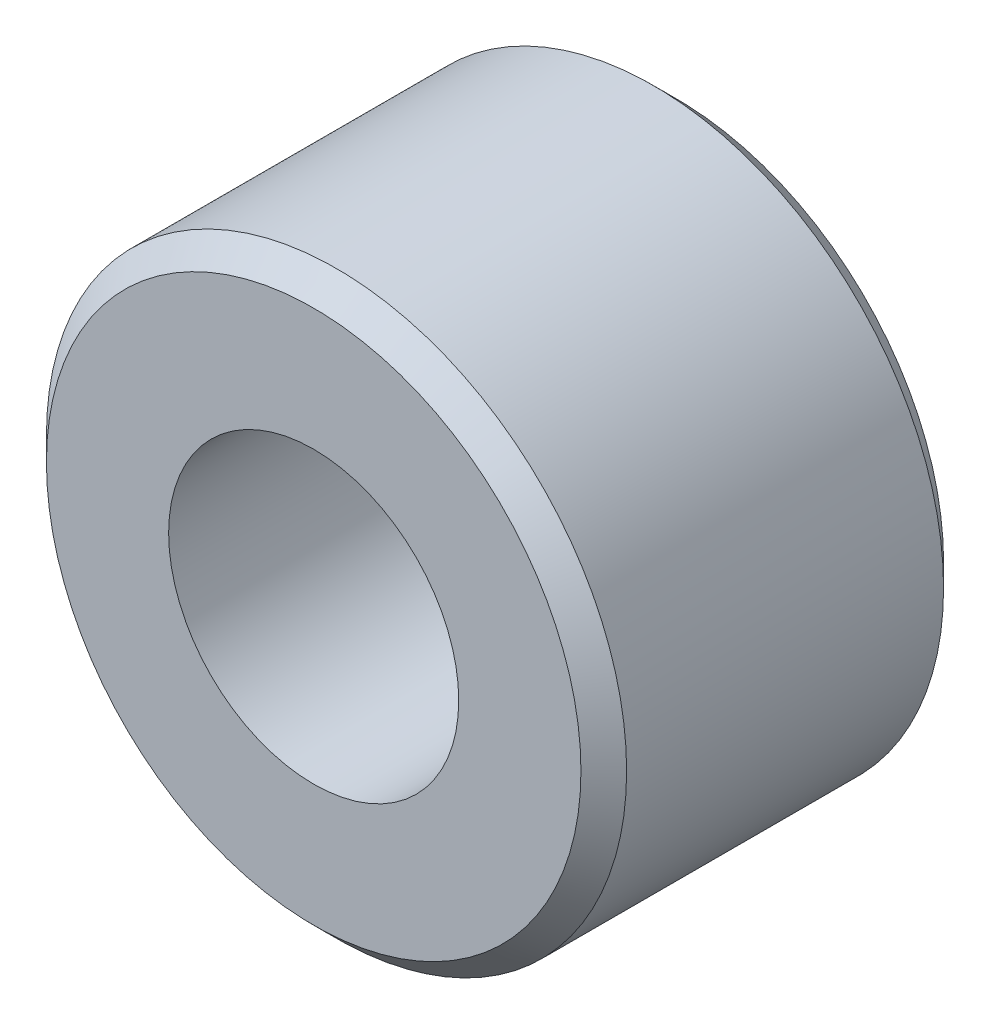
ISO-10303-21;
HEADER;
FILE_DESCRIPTION(('STEP AP214'),'2;1');
FILE_NAME('part.step','',(''),(''),'','','');
FILE_SCHEMA(('AUTOMOTIVE_DESIGN { 1 0 10303 214 1 1 1 1 }'));
ENDSEC;
DATA;
#1=APPLICATION_CONTEXT('core data for automotive mechanical design processes');
#2=APPLICATION_PROTOCOL_DEFINITION('international standard','automotive_design',2000,#1);
#3=PRODUCT_CONTEXT('',#1,'mechanical');
#4=PRODUCT('Part','Part','',(#3));
#5=PRODUCT_RELATED_PRODUCT_CATEGORY('part','',(#4));
#6=PRODUCT_DEFINITION_FORMATION('','',#4);
#7=PRODUCT_DEFINITION_CONTEXT('part definition',#1,'design');
#8=PRODUCT_DEFINITION('design','',#6,#7);
#9=PRODUCT_DEFINITION_SHAPE('','',#8);
#10=(LENGTH_UNIT() NAMED_UNIT(*) SI_UNIT(.MILLI.,.METRE.));
#11=(NAMED_UNIT(*) PLANE_ANGLE_UNIT() SI_UNIT($,.RADIAN.));
#12=(NAMED_UNIT(*) SI_UNIT($,.STERADIAN.) SOLID_ANGLE_UNIT());
#13=UNCERTAINTY_MEASURE_WITH_UNIT(LENGTH_MEASURE(1.E-05),#10,'distance_accuracy_value','');
#14=(GEOMETRIC_REPRESENTATION_CONTEXT(3) GLOBAL_UNCERTAINTY_ASSIGNED_CONTEXT((#13)) GLOBAL_UNIT_ASSIGNED_CONTEXT((#10,
#11,#12)) REPRESENTATION_CONTEXT('',''));
#15=CARTESIAN_POINT('',(0.,0.,0.));
#16=DIRECTION('',(0.,0.,1.));
#17=DIRECTION('',(1.,0.,0.));
#18=AXIS2_PLACEMENT_3D('',#15,#16,#17);
#19=CARTESIAN_POINT('',(0.,0.,31.75));
#20=DIRECTION('',(0.,0.,-1.));
#21=DIRECTION('',(-1.,0.,0.));
#22=AXIS2_PLACEMENT_3D('',#19,#20,#21);
#23=CYLINDRICAL_SURFACE('',#22,12.7);
#24=CARTESIAN_POINT('',(0.,0.,31.75));
#25=DIRECTION('',(0.,0.,1.));
#26=DIRECTION('',(1.,0.,0.));
#27=AXIS2_PLACEMENT_3D('',#24,#25,#26);
#28=CIRCLE('',#27,12.7);
#29=CARTESIAN_POINT('',(12.7,0.,31.75));
#30=VERTEX_POINT('',#29);
#31=EDGE_CURVE('E65',#30,#30,#28,.T.);
#32=ORIENTED_EDGE('',*,*,#31,.T.);
#33=EDGE_LOOP('',(#32));
#34=FACE_BOUND('',#33,.T.);
#35=CARTESIAN_POINT('',(0.,0.,0.));
#36=DIRECTION('',(0.,0.,1.));
#37=DIRECTION('',(1.,0.,0.));
#38=AXIS2_PLACEMENT_3D('',#35,#36,#37);
#39=CIRCLE('',#38,12.7);
#40=CARTESIAN_POINT('',(12.7,0.,0.));
#41=VERTEX_POINT('',#40);
#42=EDGE_CURVE('E64',#41,#41,#39,.T.);
#43=ORIENTED_EDGE('',*,*,#42,.F.);
#44=EDGE_LOOP('',(#43));
#45=FACE_BOUND('',#44,.T.);
#46=ADVANCED_FACE('F41',(#34,#45),#23,.F.);
#47=CARTESIAN_POINT('',(0.,0.,31.75));
#48=DIRECTION('',(0.,0.,-1.));
#49=DIRECTION('',(-1.,0.,0.));
#50=AXIS2_PLACEMENT_3D('',#47,#48,#49);
#51=CYLINDRICAL_SURFACE('',#50,25.4);
#52=CARTESIAN_POINT('',(0.,0.,2.));
#53=DIRECTION('',(0.,0.,1.));
#54=DIRECTION('',(1.,0.,0.));
#55=AXIS2_PLACEMENT_3D('',#52,#53,#54);
#56=CIRCLE('',#55,25.4);
#57=CARTESIAN_POINT('',(25.4,0.,2.));
#58=VERTEX_POINT('',#57);
#59=EDGE_CURVE('E52',#58,#58,#56,.T.);
#60=ORIENTED_EDGE('',*,*,#59,.T.);
#61=EDGE_LOOP('',(#60));
#62=FACE_BOUND('',#61,.T.);
#63=CARTESIAN_POINT('',(0.,0.,29.75));
#64=DIRECTION('',(0.,0.,1.));
#65=DIRECTION('',(1.,0.,0.));
#66=AXIS2_PLACEMENT_3D('',#63,#64,#65);
#67=CIRCLE('',#66,25.4);
#68=CARTESIAN_POINT('',(25.4,0.,29.75));
#69=VERTEX_POINT('',#68);
#70=EDGE_CURVE('E60',#69,#69,#67,.F.);
#71=ORIENTED_EDGE('',*,*,#70,.T.);
#72=EDGE_LOOP('',(#71));
#73=FACE_BOUND('',#72,.T.);
#74=ADVANCED_FACE('F74',(#62,#73),#51,.T.);
#75=CARTESIAN_POINT('',(0.,0.,31.75));
#76=DIRECTION('',(0.,0.,1.));
#77=DIRECTION('',(1.,0.,0.));
#78=AXIS2_PLACEMENT_3D('',#75,#76,#77);
#79=PLANE('',#78);
#80=CARTESIAN_POINT('',(0.,0.,31.75));
#81=DIRECTION('',(0.,0.,1.));
#82=DIRECTION('',(1.,0.,0.));
#83=AXIS2_PLACEMENT_3D('',#80,#81,#82);
#84=CIRCLE('',#83,23.4);
#85=CARTESIAN_POINT('',(23.4,0.,31.75));
#86=VERTEX_POINT('',#85);
#87=EDGE_CURVE('E10',#86,#86,#84,.T.);
#88=ORIENTED_EDGE('',*,*,#87,.T.);
#89=EDGE_LOOP('',(#88));
#90=FACE_BOUND('',#89,.T.);
#91=ORIENTED_EDGE('',*,*,#31,.F.);
#92=EDGE_LOOP('',(#91));
#93=FACE_BOUND('',#92,.T.);
#94=ADVANCED_FACE('F72',(#90,#93),#79,.T.);
#95=CARTESIAN_POINT('',(0.,0.,0.));
#96=DIRECTION('',(0.,0.,1.));
#97=DIRECTION('',(1.,0.,0.));
#98=AXIS2_PLACEMENT_3D('',#95,#96,#97);
#99=PLANE('',#98);
#100=CARTESIAN_POINT('',(0.,0.,0.));
#101=DIRECTION('',(0.,0.,1.));
#102=DIRECTION('',(1.,0.,0.));
#103=AXIS2_PLACEMENT_3D('',#100,#101,#102);
#104=CIRCLE('',#103,23.4);
#105=CARTESIAN_POINT('',(23.4,0.,0.));
#106=VERTEX_POINT('',#105);
#107=EDGE_CURVE('E47',#106,#106,#104,.F.);
#108=ORIENTED_EDGE('',*,*,#107,.T.);
#109=EDGE_LOOP('',(#108));
#110=FACE_BOUND('',#109,.T.);
#111=ORIENTED_EDGE('',*,*,#42,.T.);
#112=EDGE_LOOP('',(#111));
#113=FACE_BOUND('',#112,.T.);
#114=ADVANCED_FACE('F71',(#110,#113),#99,.F.);
#115=CARTESIAN_POINT('',(0.,0.,2.));
#116=DIRECTION('',(0.,0.,1.));
#117=DIRECTION('',(1.,0.,0.));
#118=AXIS2_PLACEMENT_3D('',#115,#116,#117);
#119=CONICAL_SURFACE('',#118,25.4,0.785398163397451);
#120=ORIENTED_EDGE('',*,*,#107,.F.);
#121=EDGE_LOOP('',(#120));
#122=FACE_BOUND('',#121,.T.);
#123=ORIENTED_EDGE('',*,*,#59,.F.);
#124=EDGE_LOOP('',(#123));
#125=FACE_BOUND('',#124,.T.);
#126=ADVANCED_FACE('F78',(#122,#125),#119,.T.);
#127=CARTESIAN_POINT('',(0.,0.,31.75));
#128=DIRECTION('',(0.,0.,-1.));
#129=DIRECTION('',(-1.,0.,0.));
#130=AXIS2_PLACEMENT_3D('',#127,#128,#129);
#131=CONICAL_SURFACE('',#130,23.4,0.785398163397447);
#132=ORIENTED_EDGE('',*,*,#70,.F.);
#133=EDGE_LOOP('',(#132));
#134=FACE_BOUND('',#133,.T.);
#135=ORIENTED_EDGE('',*,*,#87,.F.);
#136=EDGE_LOOP('',(#135));
#137=FACE_BOUND('',#136,.T.);
#138=ADVANCED_FACE('F42',(#134,#137),#131,.T.);
#139=CLOSED_SHELL('',(#46,#74,#94,#114,#126,#138));
#140=MANIFOLD_SOLID_BREP('B2',#139);
#141=ADVANCED_BREP_SHAPE_REPRESENTATION('',(#18,#140),#14);
#142=SHAPE_DEFINITION_REPRESENTATION(#9,#141);
ENDSEC;
END-ISO-10303-21;
